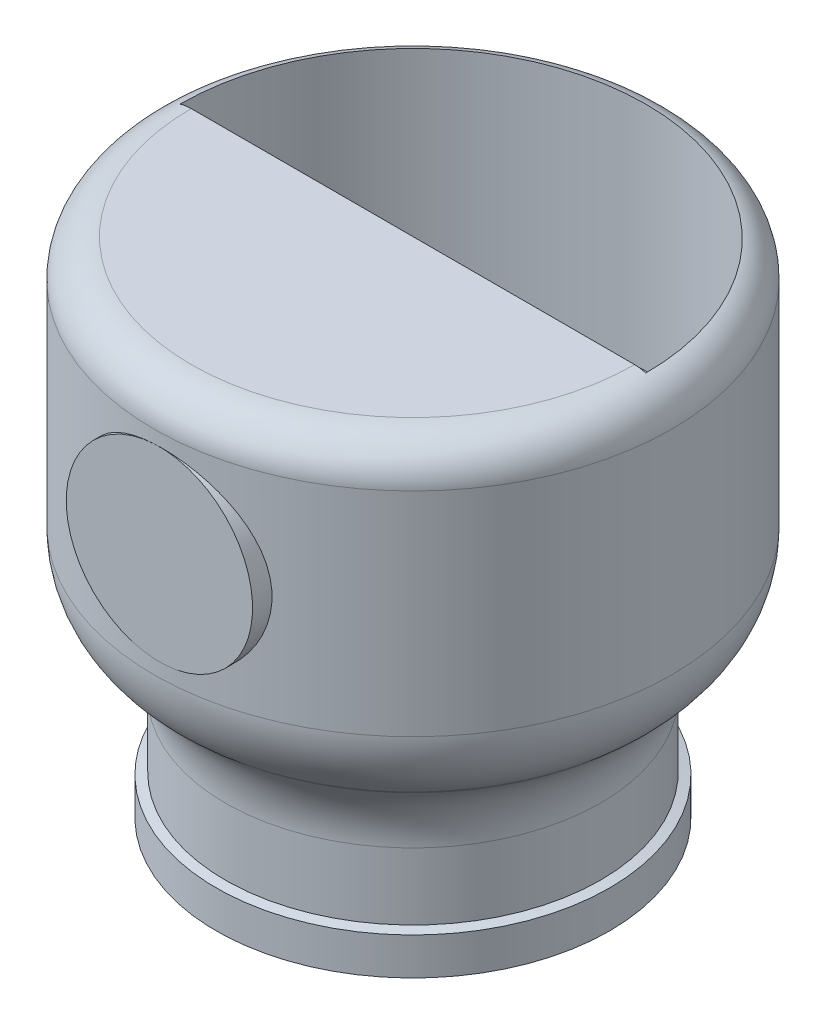
ISO-10303-21;
HEADER;
FILE_DESCRIPTION(('STEP AP214'),'2;1');
FILE_NAME('part.step','',(''),(''),'','','');
FILE_SCHEMA(('AUTOMOTIVE_DESIGN { 1 0 10303 214 1 1 1 1 }'));
ENDSEC;
DATA;
#1=APPLICATION_CONTEXT('core data for automotive mechanical design processes');
#2=APPLICATION_PROTOCOL_DEFINITION('international standard','automotive_design',2000,#1);
#3=PRODUCT_CONTEXT('',#1,'mechanical');
#4=PRODUCT('Part','Part','',(#3));
#5=PRODUCT_RELATED_PRODUCT_CATEGORY('part','',(#4));
#6=PRODUCT_DEFINITION_FORMATION('','',#4);
#7=PRODUCT_DEFINITION_CONTEXT('part definition',#1,'design');
#8=PRODUCT_DEFINITION('design','',#6,#7);
#9=PRODUCT_DEFINITION_SHAPE('','',#8);
#10=(LENGTH_UNIT() NAMED_UNIT(*) SI_UNIT(.MILLI.,.METRE.));
#11=(NAMED_UNIT(*) PLANE_ANGLE_UNIT() SI_UNIT($,.RADIAN.));
#12=(NAMED_UNIT(*) SI_UNIT($,.STERADIAN.) SOLID_ANGLE_UNIT());
#13=UNCERTAINTY_MEASURE_WITH_UNIT(LENGTH_MEASURE(1.E-05),#10,'distance_accuracy_value','');
#14=(GEOMETRIC_REPRESENTATION_CONTEXT(3) GLOBAL_UNCERTAINTY_ASSIGNED_CONTEXT((#13)) GLOBAL_UNIT_ASSIGNED_CONTEXT((#10,
#11,#12)) REPRESENTATION_CONTEXT('',''));
#15=CARTESIAN_POINT('',(0.,0.,0.));
#16=DIRECTION('',(0.,0.,1.));
#17=DIRECTION('',(1.,0.,0.));
#18=AXIS2_PLACEMENT_3D('',#15,#16,#17);
#19=CARTESIAN_POINT('',(19.9,15.,0.));
#20=DIRECTION('',(0.,-1.,0.));
#21=DIRECTION('',(1.,0.,0.));
#22=AXIS2_PLACEMENT_3D('',#19,#20,#21);
#23=PLANE('',#22);
#24=CARTESIAN_POINT('',(2.76491495539483,15.,0.));
#25=DIRECTION('',(0.,-1.,0.));
#26=DIRECTION('',(1.,0.,0.));
#27=AXIS2_PLACEMENT_3D('',#24,#25,#26);
#28=CIRCLE('',#27,17.1350850446052);
#29=CARTESIAN_POINT('',(19.9,15.,0.));
#30=VERTEX_POINT('',#29);
#31=CARTESIAN_POINT('',(-14.3701700892103,15.,0.));
#32=VERTEX_POINT('',#31);
#33=EDGE_CURVE('E137',#30,#32,#28,.T.);
#34=ORIENTED_EDGE('',*,*,#33,.T.);
#35=DIRECTION('',(1.,0.,0.));
#36=VECTOR('',#35,1.);
#37=CARTESIAN_POINT('',(19.9,15.,0.));
#38=LINE('',#37,#36);
#39=EDGE_CURVE('E50',#32,#30,#38,.T.);
#40=ORIENTED_EDGE('',*,*,#39,.T.);
#41=EDGE_LOOP('',(#34,#40));
#42=FACE_BOUND('',#41,.T.);
#43=ADVANCED_FACE('F35',(#42),#23,.T.);
#44=CARTESIAN_POINT('',(2.76491495539483,14.,0.));
#45=DIRECTION('',(0.,-1.,0.));
#46=DIRECTION('',(1.,0.,0.));
#47=AXIS2_PLACEMENT_3D('',#44,#45,#46);
#48=TOROIDAL_SURFACE('',#47,17.1350850446052,1.);
#49=CARTESIAN_POINT('',(2.76491495539483,14.,0.));
#50=DIRECTION('',(0.,-1.,0.));
#51=DIRECTION('',(1.,0.,0.));
#52=AXIS2_PLACEMENT_3D('',#49,#50,#51);
#53=CIRCLE('',#52,18.1350850446052);
#54=CARTESIAN_POINT('',(20.9,14.,0.));
#55=VERTEX_POINT('',#54);
#56=EDGE_CURVE('E134',#55,#55,#53,.T.);
#57=ORIENTED_EDGE('',*,*,#56,.T.);
#58=EDGE_LOOP('',(#57));
#59=FACE_BOUND('',#58,.T.);
#60=ORIENTED_EDGE('',*,*,#33,.F.);
#61=CARTESIAN_POINT('',(19.9,14.,0.));
#62=DIRECTION('',(0.,0.,-1.));
#63=DIRECTION('',(-1.,0.,0.));
#64=AXIS2_PLACEMENT_3D('',#61,#62,#63);
#65=CIRCLE('',#64,1.);
#66=CARTESIAN_POINT('',(20.2649149553948,14.9310408558861,0.));
#67=VERTEX_POINT('',#66);
#68=EDGE_CURVE('E108',#30,#67,#65,.T.);
#69=ORIENTED_EDGE('',*,*,#68,.T.);
#70=CARTESIAN_POINT('',(2.76491495539483,14.9310408558861,0.));
#71=DIRECTION('',(0.,-1.,0.));
#72=DIRECTION('',(1.,0.,0.));
#73=AXIS2_PLACEMENT_3D('',#70,#71,#72);
#74=CIRCLE('',#73,17.5);
#75=CARTESIAN_POINT('',(-14.7350850446052,14.9310408558861,0.));
#76=VERTEX_POINT('',#75);
#77=EDGE_CURVE('E101',#67,#76,#74,.F.);
#78=ORIENTED_EDGE('',*,*,#77,.T.);
#79=CARTESIAN_POINT('',(-14.3701700892103,14.,0.));
#80=DIRECTION('',(0.,0.,-1.));
#81=DIRECTION('',(-1.,0.,0.));
#82=AXIS2_PLACEMENT_3D('',#79,#80,#81);
#83=CIRCLE('',#82,1.);
#84=EDGE_CURVE('E91',#76,#32,#83,.T.);
#85=ORIENTED_EDGE('',*,*,#84,.T.);
#86=EDGE_LOOP('',(#60,#69,#78,#85));
#87=FACE_BOUND('',#86,.T.);
#88=ADVANCED_FACE('F107',(#59,#87),#48,.F.);
#89=CARTESIAN_POINT('',(2.76491495539482,29.,0.));
#90=DIRECTION('',(0.,1.,0.));
#91=DIRECTION('',(0.,0.,1.));
#92=AXIS2_PLACEMENT_3D('',#89,#90,#91);
#93=PLANE('',#92);
#94=DIRECTION('',(1.,0.,0.));
#95=VECTOR('',#94,1.);
#96=CARTESIAN_POINT('',(-22.2350850446052,29.,0.));
#97=LINE('',#96,#95);
#98=CARTESIAN_POINT('',(-22.2350850446052,29.,0.));
#99=VERTEX_POINT('',#98);
#100=CARTESIAN_POINT('',(-14.7350850446052,29.,0.));
#101=VERTEX_POINT('',#100);
#102=EDGE_CURVE('E122',#99,#101,#97,.T.);
#103=ORIENTED_EDGE('',*,*,#102,.T.);
#104=CARTESIAN_POINT('',(2.76491495539483,29.,0.));
#105=DIRECTION('',(0.,1.,0.));
#106=DIRECTION('',(0.,0.,1.));
#107=AXIS2_PLACEMENT_3D('',#104,#105,#106);
#108=CIRCLE('',#107,17.5);
#109=CARTESIAN_POINT('',(20.2649149553948,29.,0.));
#110=VERTEX_POINT('',#109);
#111=EDGE_CURVE('E11',#101,#110,#108,.F.);
#112=ORIENTED_EDGE('',*,*,#111,.T.);
#113=CARTESIAN_POINT('',(27.7649149553948,29.,0.));
#114=VERTEX_POINT('',#113);
#115=EDGE_CURVE('E121',#110,#114,#97,.T.);
#116=ORIENTED_EDGE('',*,*,#115,.T.);
#117=CARTESIAN_POINT('',(2.76491495539482,29.,0.));
#118=DIRECTION('',(0.,1.,0.));
#119=DIRECTION('',(0.,0.,1.));
#120=AXIS2_PLACEMENT_3D('',#117,#118,#119);
#121=CIRCLE('',#120,25.);
#122=EDGE_CURVE('E118',#114,#99,#121,.T.);
#123=ORIENTED_EDGE('',*,*,#122,.T.);
#124=EDGE_LOOP('',(#103,#112,#116,#123));
#125=FACE_BOUND('',#124,.T.);
#126=ADVANCED_FACE('F192',(#125),#93,.T.);
#127=CARTESIAN_POINT('',(2.76491495539483,7.82182165652493,0.));
#128=DIRECTION('',(0.,-1.,0.));
#129=DIRECTION('',(1.,0.,0.));
#130=AXIS2_PLACEMENT_3D('',#127,#128,#129);
#131=CYLINDRICAL_SURFACE('',#130,18.1350850446052);
#132=CARTESIAN_POINT('',(2.76491495539483,0.,0.));
#133=DIRECTION('',(0.,-1.,0.));
#134=DIRECTION('',(1.,0.,0.));
#135=AXIS2_PLACEMENT_3D('',#132,#133,#134);
#136=CIRCLE('',#135,18.1350850446052);
#137=CARTESIAN_POINT('',(20.9,0.,0.));
#138=VERTEX_POINT('',#137);
#139=EDGE_CURVE('E166',#138,#138,#136,.T.);
#140=ORIENTED_EDGE('',*,*,#139,.T.);
#141=EDGE_LOOP('',(#140));
#142=FACE_BOUND('',#141,.T.);
#143=ORIENTED_EDGE('',*,*,#56,.F.);
#144=EDGE_LOOP('',(#143));
#145=FACE_BOUND('',#144,.T.);
#146=ADVANCED_FACE('F37',(#142,#145),#131,.F.);
#147=CARTESIAN_POINT('',(20.9,0.,0.));
#148=DIRECTION('',(0.,-1.,0.));
#149=DIRECTION('',(1.,0.,0.));
#150=AXIS2_PLACEMENT_3D('',#147,#148,#149);
#151=PLANE('',#150);
#152=CARTESIAN_POINT('',(2.76491495539483,0.,0.));
#153=DIRECTION('',(0.,-1.,0.));
#154=DIRECTION('',(1.,0.,0.));
#155=AXIS2_PLACEMENT_3D('',#152,#153,#154);
#156=CIRCLE('',#155,21.1066768821093);
#157=CARTESIAN_POINT('',(23.8715918375041,0.,0.));
#158=VERTEX_POINT('',#157);
#159=EDGE_CURVE('E163',#158,#158,#156,.T.);
#160=ORIENTED_EDGE('',*,*,#159,.T.);
#161=EDGE_LOOP('',(#160));
#162=FACE_BOUND('',#161,.T.);
#163=ORIENTED_EDGE('',*,*,#139,.F.);
#164=EDGE_LOOP('',(#163));
#165=FACE_BOUND('',#164,.T.);
#166=ADVANCED_FACE('F258',(#162,#165),#151,.T.);
#167=CARTESIAN_POINT('',(2.76491495539483,7.82182165652493,0.));
#168=DIRECTION('',(0.,-1.,0.));
#169=DIRECTION('',(1.,0.,0.));
#170=AXIS2_PLACEMENT_3D('',#167,#168,#169);
#171=CYLINDRICAL_SURFACE('',#170,21.1066768821093);
#172=CARTESIAN_POINT('',(2.76491495539483,4.,0.));
#173=DIRECTION('',(0.,-1.,0.));
#174=DIRECTION('',(1.,0.,0.));
#175=AXIS2_PLACEMENT_3D('',#172,#173,#174);
#176=CIRCLE('',#175,21.1066768821093);
#177=CARTESIAN_POINT('',(23.8715918375041,4.,0.));
#178=VERTEX_POINT('',#177);
#179=EDGE_CURVE('E160',#178,#178,#176,.T.);
#180=ORIENTED_EDGE('',*,*,#179,.T.);
#181=EDGE_LOOP('',(#180));
#182=FACE_BOUND('',#181,.T.);
#183=ORIENTED_EDGE('',*,*,#159,.F.);
#184=EDGE_LOOP('',(#183));
#185=FACE_BOUND('',#184,.T.);
#186=ADVANCED_FACE('F252',(#182,#185),#171,.T.);
#187=CARTESIAN_POINT('',(2.76491495539483,4.,0.));
#188=DIRECTION('',(0.,-1.,0.));
#189=DIRECTION('',(1.,0.,0.));
#190=AXIS2_PLACEMENT_3D('',#187,#188,#189);
#191=CONICAL_SURFACE('',#190,21.1066768821093,1.33186665186768);
#192=CARTESIAN_POINT('',(2.76491495539483,4.23666284308145,0.));
#193=DIRECTION('',(0.,-1.,0.));
#194=DIRECTION('',(1.,0.,0.));
#195=AXIS2_PLACEMENT_3D('',#192,#193,#194);
#196=CIRCLE('',#195,20.1350850446052);
#197=CARTESIAN_POINT('',(22.9,4.23666284308145,0.));
#198=VERTEX_POINT('',#197);
#199=EDGE_CURVE('E157',#198,#198,#196,.T.);
#200=ORIENTED_EDGE('',*,*,#199,.T.);
#201=EDGE_LOOP('',(#200));
#202=FACE_BOUND('',#201,.T.);
#203=ORIENTED_EDGE('',*,*,#179,.F.);
#204=EDGE_LOOP('',(#203));
#205=FACE_BOUND('',#204,.T.);
#206=ADVANCED_FACE('F246',(#202,#205),#191,.T.);
#207=CARTESIAN_POINT('',(2.76491495539483,7.82182165652493,0.));
#208=DIRECTION('',(0.,-1.,0.));
#209=DIRECTION('',(1.,0.,0.));
#210=AXIS2_PLACEMENT_3D('',#207,#208,#209);
#211=CYLINDRICAL_SURFACE('',#210,20.1350850446052);
#212=CARTESIAN_POINT('',(2.76491495539483,11.4043081021399,0.));
#213=DIRECTION('',(0.,-1.,0.));
#214=DIRECTION('',(1.,0.,0.));
#215=AXIS2_PLACEMENT_3D('',#212,#213,#214);
#216=CIRCLE('',#215,20.1350850446052);
#217=CARTESIAN_POINT('',(22.9,11.4043081021399,0.));
#218=VERTEX_POINT('',#217);
#219=EDGE_CURVE('E154',#218,#218,#216,.T.);
#220=ORIENTED_EDGE('',*,*,#219,.T.);
#221=EDGE_LOOP('',(#220));
#222=FACE_BOUND('',#221,.T.);
#223=ORIENTED_EDGE('',*,*,#199,.F.);
#224=EDGE_LOOP('',(#223));
#225=FACE_BOUND('',#224,.T.);
#226=ADVANCED_FACE('F240',(#222,#225),#211,.T.);
#227=CARTESIAN_POINT('',(2.76491495539483,11.40430810214,0.));
#228=DIRECTION('',(0.,-1.,0.));
#229=DIRECTION('',(1.,0.,0.));
#230=AXIS2_PLACEMENT_3D('',#227,#228,#229);
#231=TOROIDAL_SURFACE('',#230,30.1350850446052,10.);
#232=CARTESIAN_POINT('',(2.76491495539483,19.0647525333298,0.));
#233=DIRECTION('',(0.,-1.,0.));
#234=DIRECTION('',(1.,0.,0.));
#235=AXIS2_PLACEMENT_3D('',#232,#233,#234);
#236=CIRCLE('',#235,23.7072089477399);
#237=CARTESIAN_POINT('',(26.4721239031347,19.0647525333298,0.));
#238=VERTEX_POINT('',#237);
#239=EDGE_CURVE('E151',#238,#238,#236,.T.);
#240=ORIENTED_EDGE('',*,*,#239,.T.);
#241=EDGE_LOOP('',(#240));
#242=FACE_BOUND('',#241,.T.);
#243=ORIENTED_EDGE('',*,*,#219,.F.);
#244=EDGE_LOOP('',(#243));
#245=FACE_BOUND('',#244,.T.);
#246=ADVANCED_FACE('F234',(#242,#245),#231,.F.);
#247=CARTESIAN_POINT('',(2.76491495539483,19.0647525333298,0.));
#248=DIRECTION('',(0.,1.,0.));
#249=DIRECTION('',(-1.,0.,0.));
#250=AXIS2_PLACEMENT_3D('',#247,#248,#249);
#251=CONICAL_SURFACE('',#250,23.7072089477399,0.872664625997171);
#252=CARTESIAN_POINT('',(2.76491495539483,19.4978929309155,0.));
#253=DIRECTION('',(0.,-1.,0.));
#254=DIRECTION('',(1.,0.,0.));
#255=AXIS2_PLACEMENT_3D('',#252,#253,#254);
#256=CIRCLE('',#255,24.2234055726603);
#257=CARTESIAN_POINT('',(26.9883205280551,19.4978929309155,0.));
#258=VERTEX_POINT('',#257);
#259=EDGE_CURVE('E148',#258,#258,#256,.T.);
#260=ORIENTED_EDGE('',*,*,#259,.T.);
#261=EDGE_LOOP('',(#260));
#262=FACE_BOUND('',#261,.T.);
#263=ORIENTED_EDGE('',*,*,#239,.F.);
#264=EDGE_LOOP('',(#263));
#265=FACE_BOUND('',#264,.T.);
#266=ADVANCED_FACE('F229',(#262,#265),#251,.T.);
#267=CARTESIAN_POINT('',(2.76491495539483,27.1583373621054,0.));
#268=DIRECTION('',(0.,-1.,0.));
#269=DIRECTION('',(1.,0.,0.));
#270=AXIS2_PLACEMENT_3D('',#267,#268,#269);
#271=TOROIDAL_SURFACE('',#270,17.795529475795,10.);
#272=CARTESIAN_POINT('',(2.76491495539483,27.1583373621054,0.));
#273=DIRECTION('',(0.,-1.,0.));
#274=DIRECTION('',(1.,0.,0.));
#275=AXIS2_PLACEMENT_3D('',#272,#273,#274);
#276=CIRCLE('',#275,27.795529475795);
#277=CARTESIAN_POINT('',(30.5604444311898,27.1583373621054,0.));
#278=VERTEX_POINT('',#277);
#279=EDGE_CURVE('E145',#278,#278,#276,.T.);
#280=ORIENTED_EDGE('',*,*,#279,.T.);
#281=EDGE_LOOP('',(#280));
#282=FACE_BOUND('',#281,.T.);
#283=ORIENTED_EDGE('',*,*,#259,.F.);
#284=EDGE_LOOP('',(#283));
#285=FACE_BOUND('',#284,.T.);
#286=ADVANCED_FACE('F217',(#282,#285),#271,.T.);
#287=CARTESIAN_POINT('',(2.76491495539483,7.82182165652493,0.));
#288=DIRECTION('',(0.,-1.,0.));
#289=DIRECTION('',(1.,0.,0.));
#290=AXIS2_PLACEMENT_3D('',#287,#288,#289);
#291=CYLINDRICAL_SURFACE('',#290,27.795529475795);
#292=CARTESIAN_POINT('',(13.3463458867871,38.6583373621054,25.7026220118486));
#293=CARTESIAN_POINT('',(13.3463467506797,38.9277821022739,25.7026212426184));
#294=CARTESIAN_POINT('',(13.3354465811937,39.1972148635378,25.7071171137235));
#295=CARTESIAN_POINT('',(13.2919687629021,39.7340174371551,25.7249519118154));
#296=CARTESIAN_POINT('',(13.2593923457373,40.0013873658451,25.7382903363697));
#297=CARTESIAN_POINT('',(13.1729081194495,40.5320945802206,25.7733836810905));
#298=CARTESIAN_POINT('',(13.1189995294657,40.79543171792,25.7951389093522));
#299=CARTESIAN_POINT('',(12.9903943982892,41.3162067659098,25.8463887620421));
#300=CARTESIAN_POINT('',(12.9156973821031,41.5736445412607,25.8758835633105));
#301=CARTESIAN_POINT('',(12.7464464105734,42.0802133582729,25.9416402412638));
#302=CARTESIAN_POINT('',(12.651947157288,42.329365136829,25.9778834459237));
#303=CARTESIAN_POINT('',(12.44373220242,42.8186599126973,26.0561762717797));
#304=CARTESIAN_POINT('',(12.330009340582,43.0587995123479,26.0982280554375));
#305=CARTESIAN_POINT('',(12.0842401425005,43.528602925991,26.1869948362899));
#306=CARTESIAN_POINT('',(11.9521936997097,43.7582666790585,26.2337098605997));
#307=CARTESIAN_POINT('',(11.6706780123648,44.2058963523142,26.3306095370754));
#308=CARTESIAN_POINT('',(11.5212074978844,44.4238614181689,26.3807944420297));
#309=CARTESIAN_POINT('',(11.1985025620434,44.8567103541455,26.4857726252769));
#310=CARTESIAN_POINT('',(11.0244902858668,45.0709889713522,26.5406716961283));
#311=CARTESIAN_POINT('',(10.6595087786535,45.4842923905928,26.6515143306982));
#312=CARTESIAN_POINT('',(10.4685391398865,45.683316825634,26.7074579195059));
#313=CARTESIAN_POINT('',(10.0707167754452,46.0650127403382,26.8190118536809));
#314=CARTESIAN_POINT('',(9.86386023069171,46.2476802649348,26.8746221154337));
#315=CARTESIAN_POINT('',(9.43549130510837,46.5954921209992,26.9841386350754));
#316=CARTESIAN_POINT('',(9.21397928881647,46.7606368880596,27.038044935299));
#317=CARTESIAN_POINT('',(8.74863878036111,47.0784128766494,27.1449016086897));
#318=CARTESIAN_POINT('',(8.50427674096215,47.2303042566693,27.1977325815785));
#319=CARTESIAN_POINT('',(8.00273380579803,47.5127627227737,27.2987566692341));
#320=CARTESIAN_POINT('',(7.74555800532649,47.6433381980195,27.3469516054933));
#321=CARTESIAN_POINT('',(7.2200167476639,47.8821093354802,27.4374672990011));
#322=CARTESIAN_POINT('',(6.95165142646173,47.9903052695837,27.4797881276121));
#323=CARTESIAN_POINT('',(6.40564839316566,48.1832779921821,27.5574406379041));
#324=CARTESIAN_POINT('',(6.12801115886875,48.2680559853613,27.5927726790812));
#325=CARTESIAN_POINT('',(5.57638215157694,48.4105135832943,27.6543152072922));
#326=CARTESIAN_POINT('',(5.30266011964647,48.4691091447917,27.6808239838258));
#327=CARTESIAN_POINT('',(4.75062513289938,48.5632043331973,27.7258920994341));
#328=CARTESIAN_POINT('',(4.4723122799301,48.5987044717727,27.7444516146174));
#329=CARTESIAN_POINT('',(3.91333763495258,48.6461887564039,27.7732043831257));
#330=CARTESIAN_POINT('',(3.6326765478635,48.6581797221137,27.7834000621734));
#331=CARTESIAN_POINT('',(3.07116470286908,48.6584918943381,27.7952607055486));
#332=CARTESIAN_POINT('',(2.79031395171638,48.6468139032719,27.7969259590657));
#333=CARTESIAN_POINT('',(2.24491810603403,48.6010682628443,27.7919345123894));
#334=CARTESIAN_POINT('',(1.9802701976664,48.5681695673053,27.7856967619089));
#335=CARTESIAN_POINT('',(1.45472369944559,48.4814067313321,27.7658783501912));
#336=CARTESIAN_POINT('',(1.19382496243998,48.4275434160882,27.7522979779594));
#337=CARTESIAN_POINT('',(0.677577935562517,48.2993135221171,27.7182504886453));
#338=CARTESIAN_POINT('',(0.422229730170447,48.2249466315582,27.6977832668222));
#339=CARTESIAN_POINT('',(-0.0812182002820311,48.0563308589155,27.6505861686878));
#340=CARTESIAN_POINT('',(-0.329317769825685,47.9620815506179,27.6238561581216));
#341=CARTESIAN_POINT('',(-0.818471743992125,47.753692525213,27.5646864705793));
#342=CARTESIAN_POINT('',(-1.05946155178538,47.6394127245774,27.5322065644623));
#343=CARTESIAN_POINT('',(-1.53110602263131,47.3922583555493,27.4625657330638));
#344=CARTESIAN_POINT('',(-1.76175692596454,47.2593770940488,27.4254031233522));
#345=CARTESIAN_POINT('',(-2.21130548967729,46.9759762894753,27.3474083145757));
#346=CARTESIAN_POINT('',(-2.43020277787631,46.8254561883447,27.3065759994182));
#347=CARTESIAN_POINT('',(-2.85503064445834,46.5077508697439,27.2223176301386));
#348=CARTESIAN_POINT('',(-3.06096039890063,46.340564595066,27.1788914115441));
#349=CARTESIAN_POINT('',(-3.46888943397179,45.9815950003482,27.0883184701548));
#350=CARTESIAN_POINT('',(-3.670150520127,45.7889914436546,27.0410950137027));
#351=CARTESIAN_POINT('',(-4.05588736727981,45.3877061868811,26.9463832037301));
#352=CARTESIAN_POINT('',(-4.24036262263078,45.1790240028073,26.8988948422756));
#353=CARTESIAN_POINT('',(-4.5914220414673,44.7467994372934,26.8050143466062));
#354=CARTESIAN_POINT('',(-4.75800206361397,44.5232536353894,26.7586224680701));
#355=CARTESIAN_POINT('',(-5.07212087537345,44.0626976394474,26.6683153425431));
#356=CARTESIAN_POINT('',(-5.2196603768811,43.8256879492801,26.6244000029929));
#357=CARTESIAN_POINT('',(-5.49772859126478,43.3342142456592,26.5394385045658));
#358=CARTESIAN_POINT('',(-5.62780461077978,43.0794788683478,26.4984781635685));
#359=CARTESIAN_POINT('',(-5.86586399421236,42.559232637673,26.4218991371288));
#360=CARTESIAN_POINT('',(-5.97385638830328,42.2937262421033,26.3862782699295));
#361=CARTESIAN_POINT('',(-6.1668392723074,41.7537372736574,26.3215803603233));
#362=CARTESIAN_POINT('',(-6.2518328039325,41.4792558931539,26.2925024526638));
#363=CARTESIAN_POINT('',(-6.39800337069516,40.9233418126132,26.2419203231456));
#364=CARTESIAN_POINT('',(-6.45918167304372,40.6419094832844,26.2204156983175));
#365=CARTESIAN_POINT('',(-6.55494105559617,40.0867471613471,26.1865271745711));
#366=CARTESIAN_POINT('',(-6.59056927192223,39.8132193541774,26.1737851983376));
#367=CARTESIAN_POINT('',(-6.63910912568212,39.2639004168782,26.1563847172211));
#368=CARTESIAN_POINT('',(-6.6520214135389,38.9881093517795,26.1517259808916));
#369=CARTESIAN_POINT('',(-6.65499588625463,38.436440217703,26.1506546773984));
#370=CARTESIAN_POINT('',(-6.64506227006915,38.1605621740297,26.1542405949113));
#371=CARTESIAN_POINT('',(-6.60245672026117,37.6107987661365,26.1695303281976));
#372=CARTESIAN_POINT('',(-6.56978514634915,37.3369133704626,26.1812340155494));
#373=CARTESIAN_POINT('',(-6.48373595936502,36.8037277442479,26.2117512471871));
#374=CARTESIAN_POINT('',(-6.43120768216105,36.5442730018554,26.2302724288113));
#375=CARTESIAN_POINT('',(-6.30589572281171,36.0307712719075,26.2738700992557));
#376=CARTESIAN_POINT('',(-6.23310488253185,35.7767262296359,26.2989489044905));
#377=CARTESIAN_POINT('',(-6.06790705793705,35.2758269101046,26.3548915465073));
#378=CARTESIAN_POINT('',(-5.97550466195667,35.0289709662142,26.3857540299383));
#379=CARTESIAN_POINT('',(-5.77175338960273,34.5437867607262,26.4523767744537));
#380=CARTESIAN_POINT('',(-5.66039717760229,34.3054618442483,26.4881389307914));
#381=CARTESIAN_POINT('',(-5.41581964512394,33.831564001845,26.564712662015));
#382=CARTESIAN_POINT('',(-5.28202751992324,33.5963054174963,26.605646401383));
#383=CARTESIAN_POINT('',(-4.99603821175475,33.1376763735824,26.6904723195448));
#384=CARTESIAN_POINT('',(-4.84383279563464,32.9143112967348,26.734365817827));
#385=CARTESIAN_POINT('',(-4.52202772496277,32.4808325603602,26.8238664339569));
#386=CARTESIAN_POINT('',(-4.35242713478869,32.270719614599,26.8694736438951));
#387=CARTESIAN_POINT('',(-3.99685318796656,31.864943181332,26.9611508600873));
#388=CARTESIAN_POINT('',(-3.81087945517322,31.6692800259756,27.007220876952));
#389=CARTESIAN_POINT('',(-3.41386155361355,31.2840646941256,27.1008825380269));
#390=CARTESIAN_POINT('',(-3.20202640665692,31.0953168380638,27.1484339302512));
#391=CARTESIAN_POINT('',(-2.76286436248656,30.7363456425542,27.2412455306916));
#392=CARTESIAN_POINT('',(-2.53554312242131,30.5661155968439,27.2865065651682));
#393=CARTESIAN_POINT('',(-2.06667271203996,30.2452550666619,27.3734191976298));
#394=CARTESIAN_POINT('',(-1.82511812373015,30.0946321166597,27.4150694060318));
#395=CARTESIAN_POINT('',(-1.32953585786986,29.8142919890175,27.4934506514793));
#396=CARTESIAN_POINT('',(-1.07551358642064,29.6845658530069,27.5301837953007));
#397=CARTESIAN_POINT('',(-0.558963445896263,29.4480975901194,27.5972916324096));
#398=CARTESIAN_POINT('',(-0.296532196118554,29.3411599161002,27.6277203553277));
#399=CARTESIAN_POINT('',(0.237105421191776,29.1497639570286,27.681646347434));
#400=CARTESIAN_POINT('',(0.508311784862325,29.0653056620829,27.7051436196728));
#401=CARTESIAN_POINT('',(1.05736622775294,28.9196922101092,27.7443950186722));
#402=CARTESIAN_POINT('',(1.33521203382265,28.8585291955788,27.760151756837));
#403=CARTESIAN_POINT('',(1.89543988383297,28.7600674488549,27.7833412546476));
#404=CARTESIAN_POINT('',(2.17782171303057,28.7227675903324,27.7907744071749));
#405=CARTESIAN_POINT('',(2.73014021528458,28.6736923897316,27.7968081006747));
#406=CARTESIAN_POINT('',(2.99996433279007,28.6606955856305,27.7958459939314));
#407=CARTESIAN_POINT('',(3.53963003763627,28.6565651175248,27.7860414433971));
#408=CARTESIAN_POINT('',(3.8094716239489,28.6654306374236,27.7771992937672));
#409=CARTESIAN_POINT('',(4.34716757247668,28.7048945975942,27.7517634945061));
#410=CARTESIAN_POINT('',(4.61502208219522,28.7354914080766,27.7351704262052));
#411=CARTESIAN_POINT('',(5.14683840460148,28.8180812466258,27.6945666520365));
#412=CARTESIAN_POINT('',(5.41080019683061,28.870074387102,27.6705559071988));
#413=CARTESIAN_POINT('',(5.92904610024611,28.9939919992937,27.6160569422403));
#414=CARTESIAN_POINT('',(6.18341619783529,29.0656031552389,27.5856721734139));
#415=CARTESIAN_POINT('',(6.68506895537541,29.2284645935136,27.5188646144497));
#416=CARTESIAN_POINT('',(6.93234905101865,29.3197218823934,27.4824396712259));
#417=CARTESIAN_POINT('',(7.41818360014348,29.5210909377065,27.4043623721521));
#418=CARTESIAN_POINT('',(7.65673988387677,29.6311987214527,27.3627111209994));
#419=CARTESIAN_POINT('',(8.12391548923101,29.869502337868,27.2750634742108));
#420=CARTESIAN_POINT('',(8.35253092803971,29.9977051567529,27.2290654026116));
#421=CARTESIAN_POINT('',(8.80852283960875,30.2774457183902,27.1315873881407));
#422=CARTESIAN_POINT('',(9.03538233947552,30.4297729865935,27.079954013771));
#423=CARTESIAN_POINT('',(9.47561863541725,30.7522319968814,26.9742320700564));
#424=CARTESIAN_POINT('',(9.68898924827505,30.9223718105583,26.9201423940019));
#425=CARTESIAN_POINT('',(10.1009819192527,31.2793675026282,26.8108003364131));
#426=CARTESIAN_POINT('',(10.2996021560979,31.4662254390003,26.7555478123759));
#427=CARTESIAN_POINT('',(10.6809508336662,31.8555565786895,26.6452105314894));
#428=CARTESIAN_POINT('',(10.8636790200245,32.0580300318472,26.5901257773391));
#429=CARTESIAN_POINT('',(11.2206302863772,32.4876508411687,26.4788399761401));
#430=CARTESIAN_POINT('',(11.394011161067,32.7155185914245,26.4227143435104));
#431=CARTESIAN_POINT('',(11.7208572308537,33.1857229334844,26.3137271080731));
#432=CARTESIAN_POINT('',(11.8743299975217,33.4280539730205,26.2608642683739));
#433=CARTESIAN_POINT('',(12.1603208389707,33.9258673231902,26.1599086931028));
#434=CARTESIAN_POINT('',(12.2928309519575,34.1813545820673,26.1118177725189));
#435=CARTESIAN_POINT('',(12.5356343745004,34.7036110828207,26.0219381487292));
#436=CARTESIAN_POINT('',(12.6459377702971,34.9703751358822,25.9801465865465));
#437=CARTESIAN_POINT('',(12.8433877754872,35.5135432745424,25.9041898684053));
#438=CARTESIAN_POINT('',(12.9305241387967,35.789951564566,25.8700280879356));
#439=CARTESIAN_POINT('',(13.0806448742074,36.3501956411642,25.8105348341637));
#440=CARTESIAN_POINT('',(13.143629103182,36.6340314717442,25.7852034131907));
#441=CARTESIAN_POINT('',(13.2446847730938,37.2066584983713,25.7442976712579));
#442=CARTESIAN_POINT('',(13.2827686278462,37.4954471514337,25.7287184885891));
#443=CARTESIAN_POINT('',(13.3335977957686,38.0756077855596,25.7078814502822));
#444=CARTESIAN_POINT('',(13.346344952637,38.3669795771037,25.7026228436376));
#445=CARTESIAN_POINT('',(13.3463458867871,38.6583373621054,25.7026220118486));
#446=B_SPLINE_CURVE_WITH_KNOTS('',3,(#292,#293,#294,#295,#296,#297,#298,#299,#300,#301,#302,
#303,#304,#305,#306,#307,#308,#309,#310,#311,#312,#313,#314,#315,#316,#317,#318,#319,#320,#321,
#322,#323,#324,#325,#326,#327,#328,#329,#330,#331,#332,#333,#334,#335,#336,#337,#338,#339,#340,
#341,#342,#343,#344,#345,#346,#347,#348,#349,#350,#351,#352,#353,#354,#355,#356,#357,#358,#359,
#360,#361,#362,#363,#364,#365,#366,#367,#368,#369,#370,#371,#372,#373,#374,#375,#376,#377,#378,
#379,#380,#381,#382,#383,#384,#385,#386,#387,#388,#389,#390,#391,#392,#393,#394,#395,#396,#397,
#398,#399,#400,#401,#402,#403,#404,#405,#406,#407,#408,#409,#410,#411,#412,#413,#414,#415,#416,
#417,#418,#419,#420,#421,#422,#423,#424,#425,#426,#427,#428,#429,#430,#431,#432,#433,#434,#435,
#436,#437,#438,#439,#440,#441,#442,#443,#444,#445),.UNSPECIFIED.,.T.,.F.,(4,2,2,2,2,2,2,2,2,2,2,
2,2,2,2,2,2,2,2,2,2,2,2,2,2,2,2,2,2,2,2,2,2,2,2,2,2,2,2,2,2,2,2,2,2,2,2,2,2,2,2,2,2,2,2,2,2,2,2,
2,2,2,2,2,2,2,2,2,2,2,2,2,2,2,2,2,4),(0.,0.808057267816626,1.61606862586876,2.42410956378593,
3.23216896609579,4.03802492206399,4.84418170086265,5.65034316747197,6.45656342668973,
7.29995003129204,8.14335692014369,8.98696719539949,9.83055649470299,10.7070666362457,
11.5832309794046,12.4593846774343,13.3354932952741,14.1779427925391,15.0203736251361,
15.8625600451619,16.7047179140628,17.5040433523017,18.3033373313968,19.1026434673403,
19.9019667395222,20.7071210172973,21.5125657509117,22.318035974067,23.1235573242502,
23.9702286044995,24.8169253809448,25.6638176808941,26.5106783077056,27.3764233110585,
28.2418135932405,29.1070893673299,29.972319093704,30.7996703059205,31.6269978282852,
32.4541733044068,33.2813356950554,34.0765196457537,34.8719848675378,35.6672641864203,
36.4628520021808,37.2831030231985,38.1037221688819,38.9243854758148,39.7450676410223,
40.6070903069241,41.4687997429028,42.3308393387977,43.1925083929845,44.0464558479673,
44.900402927119,45.7540617141408,46.6076802059269,47.4171058287024,48.2265012369672,
49.0358359491252,49.8451749133136,50.6422741257852,51.4396580861568,52.236873784605,
53.0343981220641,53.8677478695687,54.7014768899097,55.5353086827934,56.3691538193559,
57.2434367976375,58.117386282314,58.9916669076093,59.8655495362763,60.7398180165261,
61.6140916776499,62.4879291459793,63.3617030246541),.UNSPECIFIED.);
#447=CARTESIAN_POINT('',(2.76491495539483,48.6414199557745,27.795529475795));
#448=VERTEX_POINT('',#447);
#449=CARTESIAN_POINT('',(2.76491495539483,28.6752547684362,27.795529475795));
#450=VERTEX_POINT('',#449);
#451=EDGE_CURVE('E43',#448,#450,#446,.T.);
#452=ORIENTED_EDGE('',*,*,#451,.F.);
#453=EDGE_CURVE('E172',#450,#448,#446,.T.);
#454=ORIENTED_EDGE('',*,*,#453,.F.);
#455=EDGE_LOOP('',(#452,#454));
#456=FACE_BOUND('',#455,.T.);
#457=CARTESIAN_POINT('',(2.76491495539482,50.,0.));
#458=DIRECTION('',(0.,-1.,0.));
#459=DIRECTION('',(1.,0.,0.));
#460=AXIS2_PLACEMENT_3D('',#457,#458,#459);
#461=CIRCLE('',#460,27.795529475795);
#462=CARTESIAN_POINT('',(30.5604444311898,50.,0.));
#463=VERTEX_POINT('',#462);
#464=EDGE_CURVE('E142',#463,#463,#461,.T.);
#465=ORIENTED_EDGE('',*,*,#464,.T.);
#466=EDGE_LOOP('',(#465));
#467=FACE_BOUND('',#466,.T.);
#468=ORIENTED_EDGE('',*,*,#279,.F.);
#469=EDGE_LOOP('',(#468));
#470=FACE_BOUND('',#469,.T.);
#471=ADVANCED_FACE('F179',(#456,#467,#470),#291,.T.);
#472=CARTESIAN_POINT('',(2.76491495539482,50.,0.));
#473=DIRECTION('',(0.,-1.,0.));
#474=DIRECTION('',(1.,0.,0.));
#475=AXIS2_PLACEMENT_3D('',#472,#473,#474);
#476=TOROIDAL_SURFACE('',#475,23.795529475795,4.);
#477=CARTESIAN_POINT('',(-21.0306145204002,50.,0.));
#478=DIRECTION('',(0.,0.,1.));
#479=DIRECTION('',(1.,0.,0.));
#480=AXIS2_PLACEMENT_3D('',#477,#478,#479);
#481=CIRCLE('',#480,4.);
#482=CARTESIAN_POINT('',(-22.2350850446052,53.8143480119571,0.));
#483=VERTEX_POINT('',#482);
#484=CARTESIAN_POINT('',(-21.0306145204001,54.,0.));
#485=VERTEX_POINT('',#484);
#486=EDGE_CURVE('E132',#483,#485,#481,.F.);
#487=ORIENTED_EDGE('',*,*,#486,.F.);
#488=CARTESIAN_POINT('',(2.76491495539482,53.8143480119571,0.));
#489=DIRECTION('',(0.,-1.,0.));
#490=DIRECTION('',(1.,0.,0.));
#491=AXIS2_PLACEMENT_3D('',#488,#489,#490);
#492=CIRCLE('',#491,25.);
#493=CARTESIAN_POINT('',(27.7649149553948,53.8143480119571,0.));
#494=VERTEX_POINT('',#493);
#495=EDGE_CURVE('E171',#494,#483,#492,.F.);
#496=ORIENTED_EDGE('',*,*,#495,.F.);
#497=CARTESIAN_POINT('',(26.5604444311898,50.,0.));
#498=DIRECTION('',(0.,0.,1.));
#499=DIRECTION('',(1.,0.,0.));
#500=AXIS2_PLACEMENT_3D('',#497,#498,#499);
#501=CIRCLE('',#500,4.);
#502=CARTESIAN_POINT('',(26.5604444311898,54.,0.));
#503=VERTEX_POINT('',#502);
#504=EDGE_CURVE('E128',#503,#494,#501,.F.);
#505=ORIENTED_EDGE('',*,*,#504,.F.);
#506=CARTESIAN_POINT('',(2.76491495539482,54.,0.));
#507=DIRECTION('',(0.,-1.,0.));
#508=DIRECTION('',(1.,0.,0.));
#509=AXIS2_PLACEMENT_3D('',#506,#507,#508);
#510=CIRCLE('',#509,23.795529475795);
#511=EDGE_CURVE('E139',#503,#485,#510,.T.);
#512=ORIENTED_EDGE('',*,*,#511,.T.);
#513=EDGE_LOOP('',(#487,#496,#505,#512));
#514=FACE_BOUND('',#513,.T.);
#515=ORIENTED_EDGE('',*,*,#464,.F.);
#516=EDGE_LOOP('',(#515));
#517=FACE_BOUND('',#516,.T.);
#518=ADVANCED_FACE('F210',(#514,#517),#476,.T.);
#519=CARTESIAN_POINT('',(26.5604444311898,54.,0.));
#520=DIRECTION('',(0.,1.,0.));
#521=DIRECTION('',(-1.,0.,0.));
#522=AXIS2_PLACEMENT_3D('',#519,#520,#521);
#523=PLANE('',#522);
#524=DIRECTION('',(1.,0.,0.));
#525=VECTOR('',#524,1.);
#526=CARTESIAN_POINT('',(26.5604444311898,54.,0.));
#527=LINE('',#526,#525);
#528=EDGE_CURVE('E169',#485,#503,#527,.T.);
#529=ORIENTED_EDGE('',*,*,#528,.F.);
#530=ORIENTED_EDGE('',*,*,#511,.F.);
#531=EDGE_LOOP('',(#529,#530));
#532=FACE_BOUND('',#531,.T.);
#533=ADVANCED_FACE('F201',(#532),#523,.T.);
#534=CARTESIAN_POINT('',(2.76491495539482,29.,0.));
#535=DIRECTION('',(0.,1.,0.));
#536=DIRECTION('',(0.,0.,1.));
#537=AXIS2_PLACEMENT_3D('',#534,#535,#536);
#538=CYLINDRICAL_SURFACE('',#537,25.);
#539=ORIENTED_EDGE('',*,*,#495,.T.);
#540=DIRECTION('',(0.,1.,0.));
#541=VECTOR('',#540,1.);
#542=CARTESIAN_POINT('',(-22.2350850446052,29.,0.));
#543=LINE('',#542,#541);
#544=EDGE_CURVE('E124',#99,#483,#543,.T.);
#545=ORIENTED_EDGE('',*,*,#544,.F.);
#546=ORIENTED_EDGE('',*,*,#122,.F.);
#547=DIRECTION('',(0.,1.,0.));
#548=VECTOR('',#547,1.);
#549=CARTESIAN_POINT('',(27.7649149553948,29.,0.));
#550=LINE('',#549,#548);
#551=EDGE_CURVE('E125',#114,#494,#550,.T.);
#552=ORIENTED_EDGE('',*,*,#551,.T.);
#553=EDGE_LOOP('',(#539,#545,#546,#552));
#554=FACE_BOUND('',#553,.T.);
#555=ADVANCED_FACE('F198',(#554),#538,.F.);
#556=CARTESIAN_POINT('',(-22.2350850446052,29.,0.));
#557=DIRECTION('',(0.,0.,1.));
#558=DIRECTION('',(1.,0.,0.));
#559=AXIS2_PLACEMENT_3D('',#556,#557,#558);
#560=PLANE('',#559);
#561=ORIENTED_EDGE('',*,*,#115,.F.);
#562=DIRECTION('',(0.,-1.,0.));
#563=VECTOR('',#562,1.);
#564=CARTESIAN_POINT('',(20.2649149553948,32.,0.));
#565=LINE('',#564,#563);
#566=EDGE_CURVE('E104',#110,#67,#565,.T.);
#567=ORIENTED_EDGE('',*,*,#566,.T.);
#568=ORIENTED_EDGE('',*,*,#68,.F.);
#569=ORIENTED_EDGE('',*,*,#39,.F.);
#570=ORIENTED_EDGE('',*,*,#84,.F.);
#571=DIRECTION('',(0.,-1.,0.));
#572=VECTOR('',#571,1.);
#573=CARTESIAN_POINT('',(-14.7350850446052,32.,0.));
#574=LINE('',#573,#572);
#575=EDGE_CURVE('E56',#101,#76,#574,.T.);
#576=ORIENTED_EDGE('',*,*,#575,.F.);
#577=ORIENTED_EDGE('',*,*,#102,.F.);
#578=ORIENTED_EDGE('',*,*,#544,.T.);
#579=ORIENTED_EDGE('',*,*,#486,.T.);
#580=ORIENTED_EDGE('',*,*,#528,.T.);
#581=ORIENTED_EDGE('',*,*,#504,.T.);
#582=ORIENTED_EDGE('',*,*,#551,.F.);
#583=EDGE_LOOP('',(#561,#567,#568,#569,#570,#576,#577,#578,#579,#580,#581,#582));
#584=FACE_BOUND('',#583,.T.);
#585=ADVANCED_FACE('F93',(#584),#560,.F.);
#586=CARTESIAN_POINT('',(3.3463458867871,38.6583373621054,22.795529475795));
#587=DIRECTION('',(0.,0.,1.));
#588=DIRECTION('',(1.,0.,0.));
#589=AXIS2_PLACEMENT_3D('',#586,#587,#588);
#590=CYLINDRICAL_SURFACE('',#589,10.);
#591=CARTESIAN_POINT('',(3.3463458867871,38.6583373621054,27.795529475795));
#592=DIRECTION('',(0.,0.,1.));
#593=DIRECTION('',(1.,0.,0.));
#594=AXIS2_PLACEMENT_3D('',#591,#592,#593);
#595=CIRCLE('',#594,10.);
#596=EDGE_CURVE('E112',#448,#450,#595,.T.);
#597=ORIENTED_EDGE('',*,*,#596,.F.);
#598=ORIENTED_EDGE('',*,*,#451,.T.);
#599=EDGE_LOOP('',(#597,#598));
#600=FACE_BOUND('',#599,.T.);
#601=ADVANCED_FACE('F190',(#600),#590,.T.);
#602=CARTESIAN_POINT('',(3.3463458867871,38.6583373621054,27.795529475795));
#603=DIRECTION('',(0.,0.,1.));
#604=DIRECTION('',(1.,0.,0.));
#605=AXIS2_PLACEMENT_3D('',#602,#603,#604);
#606=PLANE('',#605);
#607=EDGE_CURVE('E109',#450,#448,#595,.T.);
#608=ORIENTED_EDGE('',*,*,#607,.T.);
#609=ORIENTED_EDGE('',*,*,#596,.T.);
#610=EDGE_LOOP('',(#608,#609));
#611=FACE_BOUND('',#610,.T.);
#612=ADVANCED_FACE('F188',(#611),#606,.T.);
#613=ORIENTED_EDGE('',*,*,#607,.F.);
#614=ORIENTED_EDGE('',*,*,#453,.T.);
#615=EDGE_LOOP('',(#613,#614));
#616=FACE_BOUND('',#615,.T.);
#617=ADVANCED_FACE('F183',(#616),#590,.T.);
#618=CARTESIAN_POINT('',(2.76491495539483,32.,0.));
#619=DIRECTION('',(0.,-1.,0.));
#620=DIRECTION('',(1.,0.,0.));
#621=AXIS2_PLACEMENT_3D('',#618,#619,#620);
#622=CYLINDRICAL_SURFACE('',#621,17.5);
#623=ORIENTED_EDGE('',*,*,#566,.F.);
#624=ORIENTED_EDGE('',*,*,#111,.F.);
#625=ORIENTED_EDGE('',*,*,#575,.T.);
#626=ORIENTED_EDGE('',*,*,#77,.F.);
#627=EDGE_LOOP('',(#623,#624,#625,#626));
#628=FACE_BOUND('',#627,.T.);
#629=ADVANCED_FACE('F100',(#628),#622,.F.);
#630=CLOSED_SHELL('',(#43,#88,#126,#146,#166,#186,#206,#226,#246,#266,#286,#471,#518,#533,#555,
#585,#601,#612,#617,#629));
#631=MANIFOLD_SOLID_BREP('B2',#630);
#632=ADVANCED_BREP_SHAPE_REPRESENTATION('',(#18,#631),#14);
#633=SHAPE_DEFINITION_REPRESENTATION(#9,#632);
ENDSEC;
END-ISO-10303-21;
